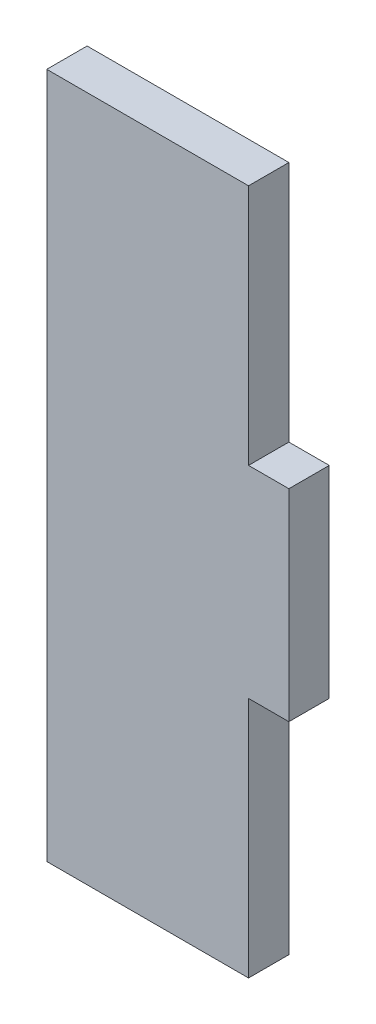
ISO-10303-21;
HEADER;
FILE_DESCRIPTION(('STEP AP214'),'2;1');
FILE_NAME('part.step','',(''),(''),'','','');
FILE_SCHEMA(('AUTOMOTIVE_DESIGN { 1 0 10303 214 1 1 1 1 }'));
ENDSEC;
DATA;
#1=APPLICATION_CONTEXT('core data for automotive mechanical design processes');
#2=APPLICATION_PROTOCOL_DEFINITION('international standard','automotive_design',2000,#1);
#3=PRODUCT_CONTEXT('',#1,'mechanical');
#4=PRODUCT('Part','Part','',(#3));
#5=PRODUCT_RELATED_PRODUCT_CATEGORY('part','',(#4));
#6=PRODUCT_DEFINITION_FORMATION('','',#4);
#7=PRODUCT_DEFINITION_CONTEXT('part definition',#1,'design');
#8=PRODUCT_DEFINITION('design','',#6,#7);
#9=PRODUCT_DEFINITION_SHAPE('','',#8);
#10=(LENGTH_UNIT() NAMED_UNIT(*) SI_UNIT(.MILLI.,.METRE.));
#11=(NAMED_UNIT(*) PLANE_ANGLE_UNIT() SI_UNIT($,.RADIAN.));
#12=(NAMED_UNIT(*) SI_UNIT($,.STERADIAN.) SOLID_ANGLE_UNIT());
#13=UNCERTAINTY_MEASURE_WITH_UNIT(LENGTH_MEASURE(1.E-05),#10,'distance_accuracy_value','');
#14=(GEOMETRIC_REPRESENTATION_CONTEXT(3) GLOBAL_UNCERTAINTY_ASSIGNED_CONTEXT((#13)) GLOBAL_UNIT_ASSIGNED_CONTEXT((#10,
#11,#12)) REPRESENTATION_CONTEXT('',''));
#15=CARTESIAN_POINT('',(0.,0.,0.));
#16=DIRECTION('',(0.,0.,1.));
#17=DIRECTION('',(1.,0.,0.));
#18=AXIS2_PLACEMENT_3D('',#15,#16,#17);
#19=CARTESIAN_POINT('',(15.,0.,3.));
#20=DIRECTION('',(0.,1.,0.));
#21=DIRECTION('',(-1.,0.,0.));
#22=AXIS2_PLACEMENT_3D('',#19,#20,#21);
#23=PLANE('',#22);
#24=DIRECTION('',(1.,0.,0.));
#25=VECTOR('',#24,1.);
#26=CARTESIAN_POINT('',(15.,0.,0.));
#27=LINE('',#26,#25);
#28=CARTESIAN_POINT('',(0.,0.,0.));
#29=VERTEX_POINT('',#28);
#30=CARTESIAN_POINT('',(15.,0.,0.));
#31=VERTEX_POINT('',#30);
#32=EDGE_CURVE('E129',#29,#31,#27,.T.);
#33=ORIENTED_EDGE('',*,*,#32,.T.);
#34=DIRECTION('',(0.,0.,-1.));
#35=VECTOR('',#34,1.);
#36=CARTESIAN_POINT('',(15.,0.,3.));
#37=LINE('',#36,#35);
#38=CARTESIAN_POINT('',(15.,0.,3.));
#39=VERTEX_POINT('',#38);
#40=EDGE_CURVE('E11',#39,#31,#37,.T.);
#41=ORIENTED_EDGE('',*,*,#40,.F.);
#42=DIRECTION('',(1.,0.,0.));
#43=VECTOR('',#42,1.);
#44=CARTESIAN_POINT('',(15.,0.,3.));
#45=LINE('',#44,#43);
#46=CARTESIAN_POINT('',(0.,0.,3.));
#47=VERTEX_POINT('',#46);
#48=EDGE_CURVE('E143',#47,#39,#45,.T.);
#49=ORIENTED_EDGE('',*,*,#48,.F.);
#50=DIRECTION('',(0.,0.,-1.));
#51=VECTOR('',#50,1.);
#52=CARTESIAN_POINT('',(0.,0.,3.));
#53=LINE('',#52,#51);
#54=EDGE_CURVE('E125',#47,#29,#53,.T.);
#55=ORIENTED_EDGE('',*,*,#54,.T.);
#56=EDGE_LOOP('',(#33,#41,#49,#55));
#57=FACE_BOUND('',#56,.T.);
#58=ADVANCED_FACE('F33',(#57),#23,.F.);
#59=CARTESIAN_POINT('',(15.,18.,3.));
#60=DIRECTION('',(-1.,0.,0.));
#61=DIRECTION('',(0.,-1.,0.));
#62=AXIS2_PLACEMENT_3D('',#59,#60,#61);
#63=PLANE('',#62);
#64=DIRECTION('',(0.,1.,0.));
#65=VECTOR('',#64,1.);
#66=CARTESIAN_POINT('',(15.,18.,0.));
#67=LINE('',#66,#65);
#68=CARTESIAN_POINT('',(15.,18.,0.));
#69=VERTEX_POINT('',#68);
#70=EDGE_CURVE('E132',#31,#69,#67,.T.);
#71=ORIENTED_EDGE('',*,*,#70,.T.);
#72=DIRECTION('',(0.,0.,-1.));
#73=VECTOR('',#72,1.);
#74=CARTESIAN_POINT('',(15.,18.,3.));
#75=LINE('',#74,#73);
#76=CARTESIAN_POINT('',(15.,18.,3.));
#77=VERTEX_POINT('',#76);
#78=EDGE_CURVE('E41',#77,#69,#75,.T.);
#79=ORIENTED_EDGE('',*,*,#78,.F.);
#80=DIRECTION('',(0.,1.,0.));
#81=VECTOR('',#80,1.);
#82=CARTESIAN_POINT('',(15.,18.,3.));
#83=LINE('',#82,#81);
#84=EDGE_CURVE('E92',#39,#77,#83,.T.);
#85=ORIENTED_EDGE('',*,*,#84,.F.);
#86=ORIENTED_EDGE('',*,*,#40,.T.);
#87=EDGE_LOOP('',(#71,#79,#85,#86));
#88=FACE_BOUND('',#87,.T.);
#89=ADVANCED_FACE('F178',(#88),#63,.F.);
#90=CARTESIAN_POINT('',(18.,18.,3.));
#91=DIRECTION('',(0.,1.,0.));
#92=DIRECTION('',(-1.,0.,0.));
#93=AXIS2_PLACEMENT_3D('',#90,#91,#92);
#94=PLANE('',#93);
#95=DIRECTION('',(1.,0.,0.));
#96=VECTOR('',#95,1.);
#97=CARTESIAN_POINT('',(18.,18.,0.));
#98=LINE('',#97,#96);
#99=CARTESIAN_POINT('',(18.,18.,0.));
#100=VERTEX_POINT('',#99);
#101=EDGE_CURVE('E134',#69,#100,#98,.T.);
#102=ORIENTED_EDGE('',*,*,#101,.T.);
#103=DIRECTION('',(0.,0.,-1.));
#104=VECTOR('',#103,1.);
#105=CARTESIAN_POINT('',(18.,18.,3.));
#106=LINE('',#105,#104);
#107=CARTESIAN_POINT('',(18.,18.,3.));
#108=VERTEX_POINT('',#107);
#109=EDGE_CURVE('E150',#108,#100,#106,.T.);
#110=ORIENTED_EDGE('',*,*,#109,.F.);
#111=DIRECTION('',(1.,0.,0.));
#112=VECTOR('',#111,1.);
#113=CARTESIAN_POINT('',(18.,18.,3.));
#114=LINE('',#113,#112);
#115=EDGE_CURVE('E158',#77,#108,#114,.T.);
#116=ORIENTED_EDGE('',*,*,#115,.F.);
#117=ORIENTED_EDGE('',*,*,#78,.T.);
#118=EDGE_LOOP('',(#102,#110,#116,#117));
#119=FACE_BOUND('',#118,.T.);
#120=ADVANCED_FACE('F156',(#119),#94,.F.);
#121=CARTESIAN_POINT('',(18.,33.,3.));
#122=DIRECTION('',(-1.,0.,0.));
#123=DIRECTION('',(0.,0.,1.));
#124=AXIS2_PLACEMENT_3D('',#121,#122,#123);
#125=PLANE('',#124);
#126=DIRECTION('',(0.,1.,0.));
#127=VECTOR('',#126,1.);
#128=CARTESIAN_POINT('',(18.,33.,0.));
#129=LINE('',#128,#127);
#130=CARTESIAN_POINT('',(18.,33.,0.));
#131=VERTEX_POINT('',#130);
#132=EDGE_CURVE('E136',#100,#131,#129,.T.);
#133=ORIENTED_EDGE('',*,*,#132,.T.);
#134=DIRECTION('',(0.,0.,-1.));
#135=VECTOR('',#134,1.);
#136=CARTESIAN_POINT('',(18.,33.,3.));
#137=LINE('',#136,#135);
#138=CARTESIAN_POINT('',(18.,33.,3.));
#139=VERTEX_POINT('',#138);
#140=EDGE_CURVE('E147',#139,#131,#137,.T.);
#141=ORIENTED_EDGE('',*,*,#140,.F.);
#142=DIRECTION('',(0.,1.,0.));
#143=VECTOR('',#142,1.);
#144=CARTESIAN_POINT('',(18.,33.,3.));
#145=LINE('',#144,#143);
#146=EDGE_CURVE('E170',#108,#139,#145,.T.);
#147=ORIENTED_EDGE('',*,*,#146,.F.);
#148=ORIENTED_EDGE('',*,*,#109,.T.);
#149=EDGE_LOOP('',(#133,#141,#147,#148));
#150=FACE_BOUND('',#149,.T.);
#151=ADVANCED_FACE('F166',(#150),#125,.F.);
#152=CARTESIAN_POINT('',(15.,33.,3.));
#153=DIRECTION('',(0.,-1.,0.));
#154=DIRECTION('',(0.,0.,-1.));
#155=AXIS2_PLACEMENT_3D('',#152,#153,#154);
#156=PLANE('',#155);
#157=DIRECTION('',(-1.,0.,0.));
#158=VECTOR('',#157,1.);
#159=CARTESIAN_POINT('',(15.,33.,0.));
#160=LINE('',#159,#158);
#161=CARTESIAN_POINT('',(15.,33.,0.));
#162=VERTEX_POINT('',#161);
#163=EDGE_CURVE('E138',#131,#162,#160,.T.);
#164=ORIENTED_EDGE('',*,*,#163,.T.);
#165=DIRECTION('',(0.,0.,-1.));
#166=VECTOR('',#165,1.);
#167=CARTESIAN_POINT('',(15.,33.,3.));
#168=LINE('',#167,#166);
#169=CARTESIAN_POINT('',(15.,33.,3.));
#170=VERTEX_POINT('',#169);
#171=EDGE_CURVE('E120',#170,#162,#168,.T.);
#172=ORIENTED_EDGE('',*,*,#171,.F.);
#173=DIRECTION('',(-1.,0.,0.));
#174=VECTOR('',#173,1.);
#175=CARTESIAN_POINT('',(15.,33.,3.));
#176=LINE('',#175,#174);
#177=EDGE_CURVE('E111',#139,#170,#176,.T.);
#178=ORIENTED_EDGE('',*,*,#177,.F.);
#179=ORIENTED_EDGE('',*,*,#140,.T.);
#180=EDGE_LOOP('',(#164,#172,#178,#179));
#181=FACE_BOUND('',#180,.T.);
#182=ADVANCED_FACE('F169',(#181),#156,.F.);
#183=CARTESIAN_POINT('',(15.,51.,3.));
#184=DIRECTION('',(-1.,0.,0.));
#185=DIRECTION('',(0.,0.,1.));
#186=AXIS2_PLACEMENT_3D('',#183,#184,#185);
#187=PLANE('',#186);
#188=DIRECTION('',(0.,1.,0.));
#189=VECTOR('',#188,1.);
#190=CARTESIAN_POINT('',(15.,51.,0.));
#191=LINE('',#190,#189);
#192=CARTESIAN_POINT('',(15.,51.,0.));
#193=VERTEX_POINT('',#192);
#194=EDGE_CURVE('E119',#162,#193,#191,.T.);
#195=ORIENTED_EDGE('',*,*,#194,.T.);
#196=DIRECTION('',(0.,0.,-1.));
#197=VECTOR('',#196,1.);
#198=CARTESIAN_POINT('',(15.,51.,3.));
#199=LINE('',#198,#197);
#200=CARTESIAN_POINT('',(15.,51.,3.));
#201=VERTEX_POINT('',#200);
#202=EDGE_CURVE('E116',#201,#193,#199,.T.);
#203=ORIENTED_EDGE('',*,*,#202,.F.);
#204=DIRECTION('',(0.,1.,0.));
#205=VECTOR('',#204,1.);
#206=CARTESIAN_POINT('',(15.,51.,3.));
#207=LINE('',#206,#205);
#208=EDGE_CURVE('E105',#170,#201,#207,.T.);
#209=ORIENTED_EDGE('',*,*,#208,.F.);
#210=ORIENTED_EDGE('',*,*,#171,.T.);
#211=EDGE_LOOP('',(#195,#203,#209,#210));
#212=FACE_BOUND('',#211,.T.);
#213=ADVANCED_FACE('F117',(#212),#187,.F.);
#214=CARTESIAN_POINT('',(0.,51.,3.));
#215=DIRECTION('',(0.,-1.,0.));
#216=DIRECTION('',(0.,0.,-1.));
#217=AXIS2_PLACEMENT_3D('',#214,#215,#216);
#218=PLANE('',#217);
#219=DIRECTION('',(-1.,0.,0.));
#220=VECTOR('',#219,1.);
#221=CARTESIAN_POINT('',(0.,51.,0.));
#222=LINE('',#221,#220);
#223=CARTESIAN_POINT('',(0.,51.,0.));
#224=VERTEX_POINT('',#223);
#225=EDGE_CURVE('E78',#193,#224,#222,.T.);
#226=ORIENTED_EDGE('',*,*,#225,.T.);
#227=DIRECTION('',(0.,0.,-1.));
#228=VECTOR('',#227,1.);
#229=CARTESIAN_POINT('',(0.,51.,3.));
#230=LINE('',#229,#228);
#231=CARTESIAN_POINT('',(0.,51.,3.));
#232=VERTEX_POINT('',#231);
#233=EDGE_CURVE('E121',#232,#224,#230,.T.);
#234=ORIENTED_EDGE('',*,*,#233,.F.);
#235=DIRECTION('',(-1.,0.,0.));
#236=VECTOR('',#235,1.);
#237=CARTESIAN_POINT('',(0.,51.,3.));
#238=LINE('',#237,#236);
#239=EDGE_CURVE('E109',#201,#232,#238,.T.);
#240=ORIENTED_EDGE('',*,*,#239,.F.);
#241=ORIENTED_EDGE('',*,*,#202,.T.);
#242=EDGE_LOOP('',(#226,#234,#240,#241));
#243=FACE_BOUND('',#242,.T.);
#244=ADVANCED_FACE('F123',(#243),#218,.F.);
#245=CARTESIAN_POINT('',(0.,0.,3.));
#246=DIRECTION('',(1.,0.,0.));
#247=DIRECTION('',(0.,1.,0.));
#248=AXIS2_PLACEMENT_3D('',#245,#246,#247);
#249=PLANE('',#248);
#250=DIRECTION('',(0.,-1.,0.));
#251=VECTOR('',#250,1.);
#252=CARTESIAN_POINT('',(0.,0.,0.));
#253=LINE('',#252,#251);
#254=EDGE_CURVE('E84',#224,#29,#253,.T.);
#255=ORIENTED_EDGE('',*,*,#254,.T.);
#256=ORIENTED_EDGE('',*,*,#54,.F.);
#257=DIRECTION('',(0.,-1.,0.));
#258=VECTOR('',#257,1.);
#259=CARTESIAN_POINT('',(0.,0.,3.));
#260=LINE('',#259,#258);
#261=EDGE_CURVE('E49',#232,#47,#260,.T.);
#262=ORIENTED_EDGE('',*,*,#261,.F.);
#263=ORIENTED_EDGE('',*,*,#233,.T.);
#264=EDGE_LOOP('',(#255,#256,#262,#263));
#265=FACE_BOUND('',#264,.T.);
#266=ADVANCED_FACE('F194',(#265),#249,.F.);
#267=CARTESIAN_POINT('',(0.,0.,3.));
#268=DIRECTION('',(0.,0.,-1.));
#269=DIRECTION('',(-1.,0.,0.));
#270=AXIS2_PLACEMENT_3D('',#267,#268,#269);
#271=PLANE('',#270);
#272=ORIENTED_EDGE('',*,*,#48,.T.);
#273=ORIENTED_EDGE('',*,*,#84,.T.);
#274=ORIENTED_EDGE('',*,*,#115,.T.);
#275=ORIENTED_EDGE('',*,*,#146,.T.);
#276=ORIENTED_EDGE('',*,*,#177,.T.);
#277=ORIENTED_EDGE('',*,*,#208,.T.);
#278=ORIENTED_EDGE('',*,*,#239,.T.);
#279=ORIENTED_EDGE('',*,*,#261,.T.);
#280=EDGE_LOOP('',(#272,#273,#274,#275,#276,#277,#278,#279));
#281=FACE_BOUND('',#280,.T.);
#282=ADVANCED_FACE('F107',(#281),#271,.F.);
#283=CARTESIAN_POINT('',(0.,0.,0.));
#284=DIRECTION('',(0.,0.,-1.));
#285=DIRECTION('',(-1.,0.,0.));
#286=AXIS2_PLACEMENT_3D('',#283,#284,#285);
#287=PLANE('',#286);
#288=ORIENTED_EDGE('',*,*,#32,.F.);
#289=ORIENTED_EDGE('',*,*,#254,.F.);
#290=ORIENTED_EDGE('',*,*,#225,.F.);
#291=ORIENTED_EDGE('',*,*,#194,.F.);
#292=ORIENTED_EDGE('',*,*,#163,.F.);
#293=ORIENTED_EDGE('',*,*,#132,.F.);
#294=ORIENTED_EDGE('',*,*,#101,.F.);
#295=ORIENTED_EDGE('',*,*,#70,.F.);
#296=EDGE_LOOP('',(#288,#289,#290,#291,#292,#293,#294,#295));
#297=FACE_BOUND('',#296,.T.);
#298=ADVANCED_FACE('F162',(#297),#287,.T.);
#299=CLOSED_SHELL('',(#58,#89,#120,#151,#182,#213,#244,#266,#282,#298));
#300=MANIFOLD_SOLID_BREP('B2',#299);
#301=ADVANCED_BREP_SHAPE_REPRESENTATION('',(#18,#300),#14);
#302=SHAPE_DEFINITION_REPRESENTATION(#9,#301);
ENDSEC;
END-ISO-10303-21;
